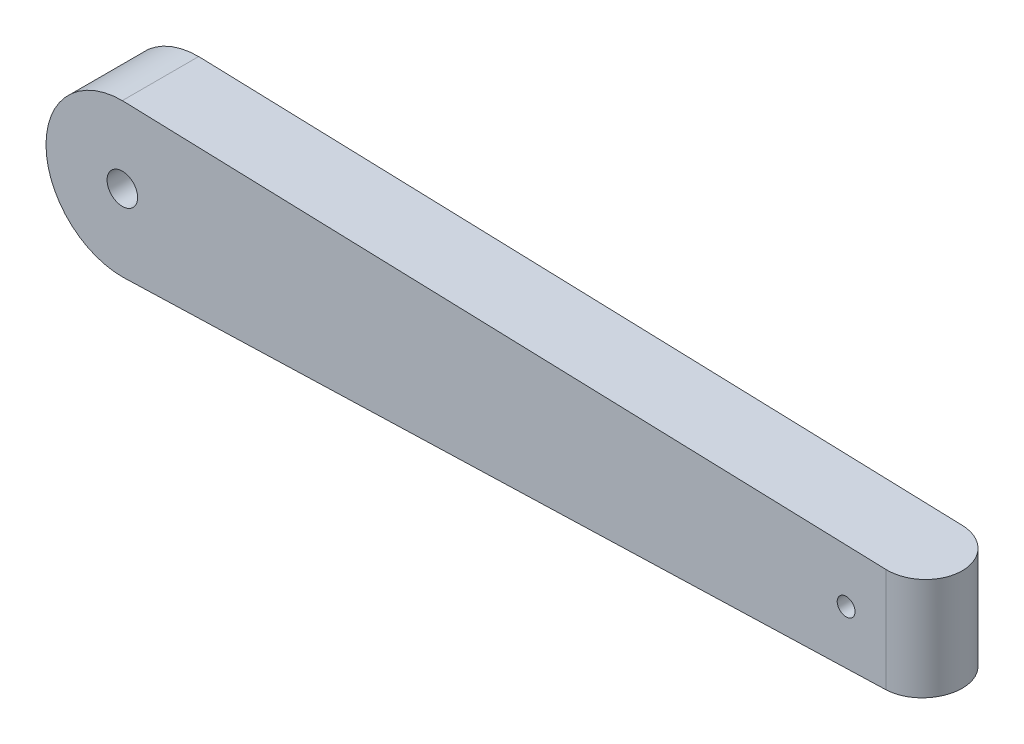
ISO-10303-21;
HEADER;
FILE_DESCRIPTION(('STEP AP214'),'2;1');
FILE_NAME('part.step','',(''),(''),'','','');
FILE_SCHEMA(('AUTOMOTIVE_DESIGN { 1 0 10303 214 1 1 1 1 }'));
ENDSEC;
DATA;
#1=APPLICATION_CONTEXT('core data for automotive mechanical design processes');
#2=APPLICATION_PROTOCOL_DEFINITION('international standard','automotive_design',2000,#1);
#3=PRODUCT_CONTEXT('',#1,'mechanical');
#4=PRODUCT('Part','Part','',(#3));
#5=PRODUCT_RELATED_PRODUCT_CATEGORY('part','',(#4));
#6=PRODUCT_DEFINITION_FORMATION('','',#4);
#7=PRODUCT_DEFINITION_CONTEXT('part definition',#1,'design');
#8=PRODUCT_DEFINITION('design','',#6,#7);
#9=PRODUCT_DEFINITION_SHAPE('','',#8);
#10=(LENGTH_UNIT() NAMED_UNIT(*) SI_UNIT(.MILLI.,.METRE.));
#11=(NAMED_UNIT(*) PLANE_ANGLE_UNIT() SI_UNIT($,.RADIAN.));
#12=(NAMED_UNIT(*) SI_UNIT($,.STERADIAN.) SOLID_ANGLE_UNIT());
#13=UNCERTAINTY_MEASURE_WITH_UNIT(LENGTH_MEASURE(1.E-05),#10,'distance_accuracy_value','');
#14=(GEOMETRIC_REPRESENTATION_CONTEXT(3) GLOBAL_UNCERTAINTY_ASSIGNED_CONTEXT((#13)) GLOBAL_UNIT_ASSIGNED_CONTEXT((#10,
#11,#12)) REPRESENTATION_CONTEXT('',''));
#15=CARTESIAN_POINT('',(0.,0.,0.));
#16=DIRECTION('',(0.,0.,1.));
#17=DIRECTION('',(1.,0.,0.));
#18=AXIS2_PLACEMENT_3D('',#15,#16,#17);
#19=CARTESIAN_POINT('',(150.,-10.2380952380952,7.5));
#20=DIRECTION('',(0.,1.,0.));
#21=DIRECTION('',(0.,0.,1.));
#22=AXIS2_PLACEMENT_3D('',#19,#20,#21);
#23=CYLINDRICAL_SURFACE('',#22,7.49999999999999);
#24=DIRECTION('',(0.,1.,0.));
#25=VECTOR('',#24,1.);
#26=CARTESIAN_POINT('',(150.,0.,15.));
#27=LINE('',#26,#25);
#28=CARTESIAN_POINT('',(150.,-10.2380952380952,15.));
#29=VERTEX_POINT('',#28);
#30=CARTESIAN_POINT('',(150.,10.2380952380952,15.));
#31=VERTEX_POINT('',#30);
#32=EDGE_CURVE('E102',#29,#31,#27,.T.);
#33=ORIENTED_EDGE('',*,*,#32,.F.);
#34=CARTESIAN_POINT('',(150.,-10.2380952380952,7.5));
#35=DIRECTION('',(-0.0317300468347736,0.999496475295367,0.));
#36=DIRECTION('',(0.999496475295367,0.0317300468347736,0.));
#37=AXIS2_PLACEMENT_3D('',#34,#35,#36);
#38=ELLIPSE('',#37,7.50377833777115,7.49999999999999);
#39=CARTESIAN_POINT('',(150.,-10.2380952380952,0.));
#40=VERTEX_POINT('',#39);
#41=EDGE_CURVE('E49',#40,#29,#38,.F.);
#42=ORIENTED_EDGE('',*,*,#41,.F.);
#43=DIRECTION('',(0.,-1.,0.));
#44=VECTOR('',#43,1.);
#45=CARTESIAN_POINT('',(150.,-10.2380952380952,0.));
#46=LINE('',#45,#44);
#47=CARTESIAN_POINT('',(150.,10.2380952380952,0.));
#48=VERTEX_POINT('',#47);
#49=EDGE_CURVE('E105',#48,#40,#46,.T.);
#50=ORIENTED_EDGE('',*,*,#49,.F.);
#51=CARTESIAN_POINT('',(150.,10.2380952380952,7.5));
#52=DIRECTION('',(-0.0317300468347736,-0.999496475295367,0.));
#53=DIRECTION('',(-0.999496475295367,0.0317300468347736,0.));
#54=AXIS2_PLACEMENT_3D('',#51,#52,#53);
#55=ELLIPSE('',#54,7.50377833777115,7.49999999999999);
#56=EDGE_CURVE('E11',#31,#48,#55,.F.);
#57=ORIENTED_EDGE('',*,*,#56,.F.);
#58=EDGE_LOOP('',(#33,#42,#50,#57));
#59=FACE_BOUND('',#58,.T.);
#60=ADVANCED_FACE('F40',(#59),#23,.T.);
#61=CARTESIAN_POINT('',(0.,0.,15.));
#62=DIRECTION('',(0.,0.,-1.));
#63=DIRECTION('',(-1.,0.,0.));
#64=AXIS2_PLACEMENT_3D('',#61,#62,#63);
#65=CYLINDRICAL_SURFACE('',#64,15.);
#66=CARTESIAN_POINT('',(0.,0.,0.));
#67=DIRECTION('',(0.,0.,1.));
#68=DIRECTION('',(-1.,0.,0.));
#69=AXIS2_PLACEMENT_3D('',#66,#67,#68);
#70=CIRCLE('',#69,15.);
#71=CARTESIAN_POINT('',(0.,15.,0.));
#72=VERTEX_POINT('',#71);
#73=CARTESIAN_POINT('',(0.,-15.,0.));
#74=VERTEX_POINT('',#73);
#75=EDGE_CURVE('E101',#72,#74,#70,.T.);
#76=ORIENTED_EDGE('',*,*,#75,.T.);
#77=DIRECTION('',(0.,0.,-1.));
#78=VECTOR('',#77,1.);
#79=CARTESIAN_POINT('',(0.,-15.,15.));
#80=LINE('',#79,#78);
#81=CARTESIAN_POINT('',(0.,-15.,15.));
#82=VERTEX_POINT('',#81);
#83=EDGE_CURVE('E85',#82,#74,#80,.T.);
#84=ORIENTED_EDGE('',*,*,#83,.F.);
#85=CARTESIAN_POINT('',(0.,0.,15.));
#86=DIRECTION('',(0.,0.,1.));
#87=DIRECTION('',(-1.,0.,0.));
#88=AXIS2_PLACEMENT_3D('',#85,#86,#87);
#89=CIRCLE('',#88,15.);
#90=CARTESIAN_POINT('',(0.,15.,15.));
#91=VERTEX_POINT('',#90);
#92=EDGE_CURVE('E90',#91,#82,#89,.T.);
#93=ORIENTED_EDGE('',*,*,#92,.F.);
#94=DIRECTION('',(0.,0.,-1.));
#95=VECTOR('',#94,1.);
#96=CARTESIAN_POINT('',(0.,15.,15.));
#97=LINE('',#96,#95);
#98=EDGE_CURVE('E103',#91,#72,#97,.T.);
#99=ORIENTED_EDGE('',*,*,#98,.T.);
#100=EDGE_LOOP('',(#76,#84,#93,#99));
#101=FACE_BOUND('',#100,.T.);
#102=ADVANCED_FACE('F99',(#101),#65,.T.);
#103=CARTESIAN_POINT('',(0.,-15.,15.));
#104=DIRECTION('',(-0.0317300468347736,0.999496475295367,0.));
#105=DIRECTION('',(-0.999496475295367,-0.0317300468347736,0.));
#106=AXIS2_PLACEMENT_3D('',#103,#104,#105);
#107=PLANE('',#106);
#108=DIRECTION('',(0.999496475295367,0.0317300468347736,0.));
#109=VECTOR('',#108,1.);
#110=CARTESIAN_POINT('',(0.,-15.,0.));
#111=LINE('',#110,#109);
#112=EDGE_CURVE('E116',#74,#40,#111,.T.);
#113=ORIENTED_EDGE('',*,*,#112,.T.);
#114=ORIENTED_EDGE('',*,*,#41,.T.);
#115=DIRECTION('',(0.999496475295367,0.0317300468347736,0.));
#116=VECTOR('',#115,1.);
#117=CARTESIAN_POINT('',(0.,-15.,15.));
#118=LINE('',#117,#116);
#119=EDGE_CURVE('E80',#82,#29,#118,.T.);
#120=ORIENTED_EDGE('',*,*,#119,.F.);
#121=ORIENTED_EDGE('',*,*,#83,.T.);
#122=EDGE_LOOP('',(#113,#114,#120,#121));
#123=FACE_BOUND('',#122,.T.);
#124=ADVANCED_FACE('F83',(#123),#107,.F.);
#125=CARTESIAN_POINT('',(0.,15.,15.));
#126=DIRECTION('',(-0.0317300468347736,-0.999496475295367,0.));
#127=DIRECTION('',(0.999496475295367,-0.0317300468347736,0.));
#128=AXIS2_PLACEMENT_3D('',#125,#126,#127);
#129=PLANE('',#128);
#130=DIRECTION('',(-0.999496475295367,0.0317300468347736,0.));
#131=VECTOR('',#130,1.);
#132=CARTESIAN_POINT('',(0.,15.,15.));
#133=LINE('',#132,#131);
#134=EDGE_CURVE('E89',#31,#91,#133,.T.);
#135=ORIENTED_EDGE('',*,*,#134,.F.);
#136=ORIENTED_EDGE('',*,*,#56,.T.);
#137=DIRECTION('',(-0.999496475295367,0.0317300468347736,0.));
#138=VECTOR('',#137,1.);
#139=CARTESIAN_POINT('',(0.,15.,0.));
#140=LINE('',#139,#138);
#141=EDGE_CURVE('E97',#48,#72,#140,.T.);
#142=ORIENTED_EDGE('',*,*,#141,.T.);
#143=ORIENTED_EDGE('',*,*,#98,.F.);
#144=EDGE_LOOP('',(#135,#136,#142,#143));
#145=FACE_BOUND('',#144,.T.);
#146=ADVANCED_FACE('F128',(#145),#129,.F.);
#147=CARTESIAN_POINT('',(0.,0.,15.));
#148=DIRECTION('',(0.,0.,-1.));
#149=DIRECTION('',(-1.,0.,0.));
#150=AXIS2_PLACEMENT_3D('',#147,#148,#149);
#151=PLANE('',#150);
#152=CARTESIAN_POINT('',(0.,0.,15.));
#153=DIRECTION('',(0.,0.,1.));
#154=DIRECTION('',(1.,0.,0.));
#155=AXIS2_PLACEMENT_3D('',#152,#153,#154);
#156=CIRCLE('',#155,3.);
#157=CARTESIAN_POINT('',(3.,0.,15.));
#158=VERTEX_POINT('',#157);
#159=EDGE_CURVE('E123',#158,#158,#156,.T.);
#160=ORIENTED_EDGE('',*,*,#159,.F.);
#161=EDGE_LOOP('',(#160));
#162=FACE_BOUND('',#161,.T.);
#163=CARTESIAN_POINT('',(142.197100848721,0.,15.));
#164=DIRECTION('',(0.,0.,1.));
#165=DIRECTION('',(1.,0.,0.));
#166=AXIS2_PLACEMENT_3D('',#163,#164,#165);
#167=CIRCLE('',#166,1.75000000000001);
#168=CARTESIAN_POINT('',(143.947100848721,0.,15.));
#169=VERTEX_POINT('',#168);
#170=EDGE_CURVE('E113',#169,#169,#167,.T.);
#171=ORIENTED_EDGE('',*,*,#170,.F.);
#172=EDGE_LOOP('',(#171));
#173=FACE_BOUND('',#172,.T.);
#174=ORIENTED_EDGE('',*,*,#119,.T.);
#175=ORIENTED_EDGE('',*,*,#32,.T.);
#176=ORIENTED_EDGE('',*,*,#134,.T.);
#177=ORIENTED_EDGE('',*,*,#92,.T.);
#178=EDGE_LOOP('',(#174,#175,#176,#177));
#179=FACE_BOUND('',#178,.T.);
#180=ADVANCED_FACE('F93',(#162,#173,#179),#151,.F.);
#181=CARTESIAN_POINT('',(0.,0.,0.));
#182=DIRECTION('',(0.,0.,-1.));
#183=DIRECTION('',(-1.,0.,0.));
#184=AXIS2_PLACEMENT_3D('',#181,#182,#183);
#185=PLANE('',#184);
#186=CARTESIAN_POINT('',(0.,0.,0.));
#187=DIRECTION('',(0.,0.,-1.));
#188=DIRECTION('',(-1.,0.,0.));
#189=AXIS2_PLACEMENT_3D('',#186,#187,#188);
#190=CIRCLE('',#189,3.);
#191=CARTESIAN_POINT('',(-3.,0.,0.));
#192=VERTEX_POINT('',#191);
#193=EDGE_CURVE('E44',#192,#192,#190,.T.);
#194=ORIENTED_EDGE('',*,*,#193,.F.);
#195=EDGE_LOOP('',(#194));
#196=FACE_BOUND('',#195,.T.);
#197=CARTESIAN_POINT('',(142.197100848721,0.,0.));
#198=DIRECTION('',(0.,0.,-1.));
#199=DIRECTION('',(-1.,0.,0.));
#200=AXIS2_PLACEMENT_3D('',#197,#198,#199);
#201=CIRCLE('',#200,1.75000000000001);
#202=CARTESIAN_POINT('',(140.447100848721,0.,0.));
#203=VERTEX_POINT('',#202);
#204=EDGE_CURVE('E111',#203,#203,#201,.T.);
#205=ORIENTED_EDGE('',*,*,#204,.F.);
#206=EDGE_LOOP('',(#205));
#207=FACE_BOUND('',#206,.T.);
#208=ORIENTED_EDGE('',*,*,#141,.F.);
#209=ORIENTED_EDGE('',*,*,#49,.T.);
#210=ORIENTED_EDGE('',*,*,#112,.F.);
#211=ORIENTED_EDGE('',*,*,#75,.F.);
#212=EDGE_LOOP('',(#208,#209,#210,#211));
#213=FACE_BOUND('',#212,.T.);
#214=ADVANCED_FACE('F130',(#196,#207,#213),#185,.T.);
#215=CARTESIAN_POINT('',(142.197100848721,0.,-17.));
#216=DIRECTION('',(0.,0.,1.));
#217=DIRECTION('',(1.,0.,0.));
#218=AXIS2_PLACEMENT_3D('',#215,#216,#217);
#219=CYLINDRICAL_SURFACE('',#218,1.75000000000001);
#220=ORIENTED_EDGE('',*,*,#204,.T.);
#221=EDGE_LOOP('',(#220));
#222=FACE_BOUND('',#221,.T.);
#223=ORIENTED_EDGE('',*,*,#170,.T.);
#224=EDGE_LOOP('',(#223));
#225=FACE_BOUND('',#224,.T.);
#226=ADVANCED_FACE('F144',(#222,#225),#219,.F.);
#227=CARTESIAN_POINT('',(0.,0.,-32.));
#228=DIRECTION('',(0.,0.,1.));
#229=DIRECTION('',(1.,0.,0.));
#230=AXIS2_PLACEMENT_3D('',#227,#228,#229);
#231=CYLINDRICAL_SURFACE('',#230,3.);
#232=ORIENTED_EDGE('',*,*,#193,.T.);
#233=EDGE_LOOP('',(#232));
#234=FACE_BOUND('',#233,.T.);
#235=ORIENTED_EDGE('',*,*,#159,.T.);
#236=EDGE_LOOP('',(#235));
#237=FACE_BOUND('',#236,.T.);
#238=ADVANCED_FACE('F151',(#234,#237),#231,.F.);
#239=CLOSED_SHELL('',(#60,#102,#124,#146,#180,#214,#226,#238));
#240=MANIFOLD_SOLID_BREP('B2',#239);
#241=ADVANCED_BREP_SHAPE_REPRESENTATION('',(#18,#240),#14);
#242=SHAPE_DEFINITION_REPRESENTATION(#9,#241);
ENDSEC;
END-ISO-10303-21;
